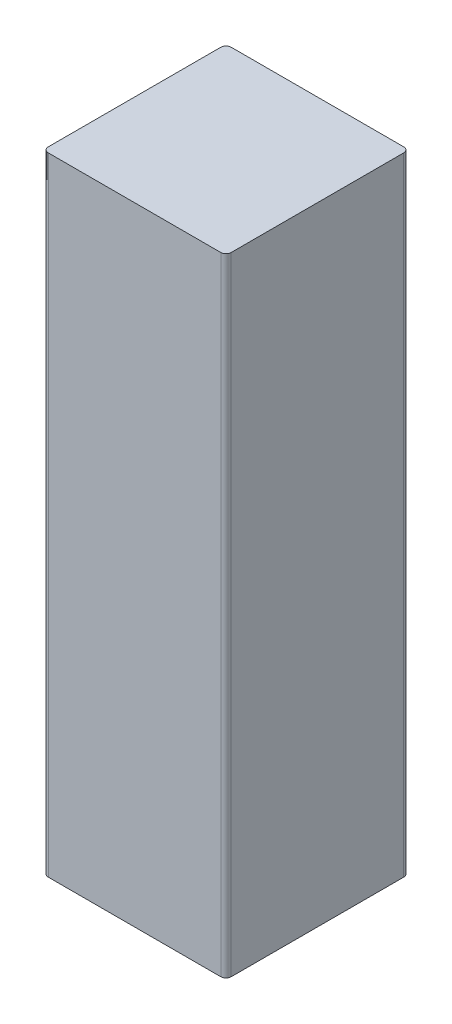
ISO-10303-21;
HEADER;
FILE_DESCRIPTION(('STEP AP214'),'2;1');
FILE_NAME('part.step','',(''),(''),'','','');
FILE_SCHEMA(('AUTOMOTIVE_DESIGN { 1 0 10303 214 1 1 1 1 }'));
ENDSEC;
DATA;
#1=APPLICATION_CONTEXT('core data for automotive mechanical design processes');
#2=APPLICATION_PROTOCOL_DEFINITION('international standard','automotive_design',2000,#1);
#3=PRODUCT_CONTEXT('',#1,'mechanical');
#4=PRODUCT('Part','Part','',(#3));
#5=PRODUCT_RELATED_PRODUCT_CATEGORY('part','',(#4));
#6=PRODUCT_DEFINITION_FORMATION('','',#4);
#7=PRODUCT_DEFINITION_CONTEXT('part definition',#1,'design');
#8=PRODUCT_DEFINITION('design','',#6,#7);
#9=PRODUCT_DEFINITION_SHAPE('','',#8);
#10=(LENGTH_UNIT() NAMED_UNIT(*) SI_UNIT(.MILLI.,.METRE.));
#11=(NAMED_UNIT(*) PLANE_ANGLE_UNIT() SI_UNIT($,.RADIAN.));
#12=(NAMED_UNIT(*) SI_UNIT($,.STERADIAN.) SOLID_ANGLE_UNIT());
#13=UNCERTAINTY_MEASURE_WITH_UNIT(LENGTH_MEASURE(1.E-05),#10,'distance_accuracy_value','');
#14=(GEOMETRIC_REPRESENTATION_CONTEXT(3) GLOBAL_UNCERTAINTY_ASSIGNED_CONTEXT((#13)) GLOBAL_UNIT_ASSIGNED_CONTEXT((#10,
#11,#12)) REPRESENTATION_CONTEXT('',''));
#15=CARTESIAN_POINT('',(0.,0.,0.));
#16=DIRECTION('',(0.,0.,1.));
#17=DIRECTION('',(1.,0.,0.));
#18=AXIS2_PLACEMENT_3D('',#15,#16,#17);
#19=CARTESIAN_POINT('',(44.45,304.8,-44.45));
#20=DIRECTION('',(-1.,0.,0.));
#21=DIRECTION('',(0.,0.,1.));
#22=AXIS2_PLACEMENT_3D('',#19,#20,#21);
#23=PLANE('',#22);
#24=DIRECTION('',(0.,0.,-1.));
#25=VECTOR('',#24,1.);
#26=CARTESIAN_POINT('',(44.45,0.,-44.45));
#27=LINE('',#26,#25);
#28=CARTESIAN_POINT('',(44.45,0.,41.9099999999999));
#29=VERTEX_POINT('',#28);
#30=CARTESIAN_POINT('',(44.45,0.,-41.91));
#31=VERTEX_POINT('',#30);
#32=EDGE_CURVE('E143',#29,#31,#27,.T.);
#33=ORIENTED_EDGE('',*,*,#32,.T.);
#34=DIRECTION('',(0.,-1.,0.));
#35=VECTOR('',#34,1.);
#36=CARTESIAN_POINT('',(44.45,304.8,-41.91));
#37=LINE('',#36,#35);
#38=CARTESIAN_POINT('',(44.45,304.8,-41.91));
#39=VERTEX_POINT('',#38);
#40=EDGE_CURVE('E11',#31,#39,#37,.F.);
#41=ORIENTED_EDGE('',*,*,#40,.T.);
#42=DIRECTION('',(0.,0.,-1.));
#43=VECTOR('',#42,1.);
#44=CARTESIAN_POINT('',(44.45,304.8,-44.45));
#45=LINE('',#44,#43);
#46=CARTESIAN_POINT('',(44.45,304.8,41.9099999999999));
#47=VERTEX_POINT('',#46);
#48=EDGE_CURVE('E141',#47,#39,#45,.T.);
#49=ORIENTED_EDGE('',*,*,#48,.F.);
#50=DIRECTION('',(0.,-1.,0.));
#51=VECTOR('',#50,1.);
#52=CARTESIAN_POINT('',(44.45,304.8,41.9099999999999));
#53=LINE('',#52,#51);
#54=EDGE_CURVE('E50',#47,#29,#53,.T.);
#55=ORIENTED_EDGE('',*,*,#54,.T.);
#56=EDGE_LOOP('',(#33,#41,#49,#55));
#57=FACE_BOUND('',#56,.T.);
#58=ADVANCED_FACE('F41',(#57),#23,.F.);
#59=CARTESIAN_POINT('',(-44.45,304.8,-44.45));
#60=DIRECTION('',(0.,0.,1.));
#61=DIRECTION('',(1.,0.,0.));
#62=AXIS2_PLACEMENT_3D('',#59,#60,#61);
#63=PLANE('',#62);
#64=DIRECTION('',(-1.,0.,0.));
#65=VECTOR('',#64,1.);
#66=CARTESIAN_POINT('',(-44.45,0.,-44.45));
#67=LINE('',#66,#65);
#68=CARTESIAN_POINT('',(41.91,0.,-44.45));
#69=VERTEX_POINT('',#68);
#70=CARTESIAN_POINT('',(-41.91,0.,-44.45));
#71=VERTEX_POINT('',#70);
#72=EDGE_CURVE('E137',#69,#71,#67,.T.);
#73=ORIENTED_EDGE('',*,*,#72,.T.);
#74=DIRECTION('',(0.,-1.,0.));
#75=VECTOR('',#74,1.);
#76=CARTESIAN_POINT('',(-41.91,304.8,-44.45));
#77=LINE('',#76,#75);
#78=CARTESIAN_POINT('',(-41.91,304.8,-44.45));
#79=VERTEX_POINT('',#78);
#80=EDGE_CURVE('E113',#71,#79,#77,.F.);
#81=ORIENTED_EDGE('',*,*,#80,.T.);
#82=DIRECTION('',(-1.,0.,0.));
#83=VECTOR('',#82,1.);
#84=CARTESIAN_POINT('',(-44.45,304.8,-44.45));
#85=LINE('',#84,#83);
#86=CARTESIAN_POINT('',(41.91,304.8,-44.45));
#87=VERTEX_POINT('',#86);
#88=EDGE_CURVE('E195',#87,#79,#85,.T.);
#89=ORIENTED_EDGE('',*,*,#88,.F.);
#90=DIRECTION('',(0.,-1.,0.));
#91=VECTOR('',#90,1.);
#92=CARTESIAN_POINT('',(41.91,304.8,-44.45));
#93=LINE('',#92,#91);
#94=EDGE_CURVE('E119',#87,#69,#93,.T.);
#95=ORIENTED_EDGE('',*,*,#94,.T.);
#96=EDGE_LOOP('',(#73,#81,#89,#95));
#97=FACE_BOUND('',#96,.T.);
#98=ADVANCED_FACE('F207',(#97),#63,.F.);
#99=CARTESIAN_POINT('',(-44.45,304.8,-44.45));
#100=DIRECTION('',(1.,0.,0.));
#101=DIRECTION('',(0.,0.,-1.));
#102=AXIS2_PLACEMENT_3D('',#99,#100,#101);
#103=PLANE('',#102);
#104=DIRECTION('',(0.,0.,1.));
#105=VECTOR('',#104,1.);
#106=CARTESIAN_POINT('',(-44.45,304.8,-44.45));
#107=LINE('',#106,#105);
#108=CARTESIAN_POINT('',(-44.45,304.8,-41.91));
#109=VERTEX_POINT('',#108);
#110=CARTESIAN_POINT('',(-44.45,304.8,41.91));
#111=VERTEX_POINT('',#110);
#112=EDGE_CURVE('E128',#109,#111,#107,.T.);
#113=ORIENTED_EDGE('',*,*,#112,.F.);
#114=DIRECTION('',(0.,-1.,0.));
#115=VECTOR('',#114,1.);
#116=CARTESIAN_POINT('',(-44.45,304.8,-41.91));
#117=LINE('',#116,#115);
#118=CARTESIAN_POINT('',(-44.45,0.,-41.91));
#119=VERTEX_POINT('',#118);
#120=EDGE_CURVE('E112',#109,#119,#117,.T.);
#121=ORIENTED_EDGE('',*,*,#120,.T.);
#122=DIRECTION('',(0.,0.,1.));
#123=VECTOR('',#122,1.);
#124=CARTESIAN_POINT('',(-44.45,0.,-44.45));
#125=LINE('',#124,#123);
#126=CARTESIAN_POINT('',(-44.45,0.,41.91));
#127=VERTEX_POINT('',#126);
#128=EDGE_CURVE('E126',#119,#127,#125,.T.);
#129=ORIENTED_EDGE('',*,*,#128,.T.);
#130=DIRECTION('',(0.,-1.,0.));
#131=VECTOR('',#130,1.);
#132=CARTESIAN_POINT('',(-44.45,304.8,41.91));
#133=LINE('',#132,#131);
#134=EDGE_CURVE('E131',#127,#111,#133,.F.);
#135=ORIENTED_EDGE('',*,*,#134,.T.);
#136=EDGE_LOOP('',(#113,#121,#129,#135));
#137=FACE_BOUND('',#136,.T.);
#138=ADVANCED_FACE('F125',(#137),#103,.F.);
#139=CARTESIAN_POINT('',(-44.45,304.8,44.45));
#140=DIRECTION('',(0.,0.,-1.));
#141=DIRECTION('',(-1.,0.,0.));
#142=AXIS2_PLACEMENT_3D('',#139,#140,#141);
#143=PLANE('',#142);
#144=DIRECTION('',(1.,0.,0.));
#145=VECTOR('',#144,1.);
#146=CARTESIAN_POINT('',(-44.45,304.8,44.45));
#147=LINE('',#146,#145);
#148=CARTESIAN_POINT('',(-41.91,304.8,44.45));
#149=VERTEX_POINT('',#148);
#150=CARTESIAN_POINT('',(41.91,304.8,44.45));
#151=VERTEX_POINT('',#150);
#152=EDGE_CURVE('E148',#149,#151,#147,.T.);
#153=ORIENTED_EDGE('',*,*,#152,.F.);
#154=DIRECTION('',(0.,-1.,0.));
#155=VECTOR('',#154,1.);
#156=CARTESIAN_POINT('',(-41.91,304.8,44.45));
#157=LINE('',#156,#155);
#158=CARTESIAN_POINT('',(-41.91,0.,44.45));
#159=VERTEX_POINT('',#158);
#160=EDGE_CURVE('E175',#149,#159,#157,.T.);
#161=ORIENTED_EDGE('',*,*,#160,.T.);
#162=DIRECTION('',(1.,0.,0.));
#163=VECTOR('',#162,1.);
#164=CARTESIAN_POINT('',(-44.45,0.,44.45));
#165=LINE('',#164,#163);
#166=CARTESIAN_POINT('',(41.91,0.,44.45));
#167=VERTEX_POINT('',#166);
#168=EDGE_CURVE('E136',#159,#167,#165,.T.);
#169=ORIENTED_EDGE('',*,*,#168,.T.);
#170=DIRECTION('',(0.,-1.,0.));
#171=VECTOR('',#170,1.);
#172=CARTESIAN_POINT('',(41.91,304.8,44.45));
#173=LINE('',#172,#171);
#174=EDGE_CURVE('E57',#167,#151,#173,.F.);
#175=ORIENTED_EDGE('',*,*,#174,.T.);
#176=EDGE_LOOP('',(#153,#161,#169,#175));
#177=FACE_BOUND('',#176,.T.);
#178=ADVANCED_FACE('F211',(#177),#143,.F.);
#179=CARTESIAN_POINT('',(0.,304.8,0.));
#180=DIRECTION('',(0.,1.,0.));
#181=DIRECTION('',(0.,0.,1.));
#182=AXIS2_PLACEMENT_3D('',#179,#180,#181);
#183=PLANE('',#182);
#184=ORIENTED_EDGE('',*,*,#88,.T.);
#185=CARTESIAN_POINT('',(-41.91,304.8,-41.91));
#186=DIRECTION('',(0.,1.,0.));
#187=DIRECTION('',(0.,0.,1.));
#188=AXIS2_PLACEMENT_3D('',#185,#186,#187);
#189=CIRCLE('',#188,2.54);
#190=EDGE_CURVE('E170',#79,#109,#189,.T.);
#191=ORIENTED_EDGE('',*,*,#190,.T.);
#192=ORIENTED_EDGE('',*,*,#112,.T.);
#193=CARTESIAN_POINT('',(-41.91,304.8,41.91));
#194=DIRECTION('',(0.,1.,0.));
#195=DIRECTION('',(0.,0.,1.));
#196=AXIS2_PLACEMENT_3D('',#193,#194,#195);
#197=CIRCLE('',#196,2.54);
#198=EDGE_CURVE('E64',#111,#149,#197,.T.);
#199=ORIENTED_EDGE('',*,*,#198,.T.);
#200=ORIENTED_EDGE('',*,*,#152,.T.);
#201=CARTESIAN_POINT('',(41.91,304.8,41.9099999999999));
#202=DIRECTION('',(0.,1.,0.));
#203=DIRECTION('',(0.,0.,1.));
#204=AXIS2_PLACEMENT_3D('',#201,#202,#203);
#205=CIRCLE('',#204,2.54);
#206=EDGE_CURVE('E162',#151,#47,#205,.T.);
#207=ORIENTED_EDGE('',*,*,#206,.T.);
#208=ORIENTED_EDGE('',*,*,#48,.T.);
#209=CARTESIAN_POINT('',(41.91,304.8,-41.91));
#210=DIRECTION('',(0.,1.,0.));
#211=DIRECTION('',(0.,0.,1.));
#212=AXIS2_PLACEMENT_3D('',#209,#210,#211);
#213=CIRCLE('',#212,2.54);
#214=EDGE_CURVE('E165',#39,#87,#213,.T.);
#215=ORIENTED_EDGE('',*,*,#214,.T.);
#216=EDGE_LOOP('',(#184,#191,#192,#199,#200,#207,#208,#215));
#217=FACE_BOUND('',#216,.T.);
#218=ADVANCED_FACE('F201',(#217),#183,.T.);
#219=CARTESIAN_POINT('',(0.,0.,0.));
#220=DIRECTION('',(0.,1.,0.));
#221=DIRECTION('',(0.,0.,1.));
#222=AXIS2_PLACEMENT_3D('',#219,#220,#221);
#223=PLANE('',#222);
#224=ORIENTED_EDGE('',*,*,#128,.F.);
#225=CARTESIAN_POINT('',(-41.91,0.,-41.91));
#226=DIRECTION('',(0.,1.,0.));
#227=DIRECTION('',(0.,0.,1.));
#228=AXIS2_PLACEMENT_3D('',#225,#226,#227);
#229=CIRCLE('',#228,2.54);
#230=EDGE_CURVE('E108',#119,#71,#229,.F.);
#231=ORIENTED_EDGE('',*,*,#230,.T.);
#232=ORIENTED_EDGE('',*,*,#72,.F.);
#233=CARTESIAN_POINT('',(41.91,0.,-41.91));
#234=DIRECTION('',(0.,1.,0.));
#235=DIRECTION('',(0.,0.,1.));
#236=AXIS2_PLACEMENT_3D('',#233,#234,#235);
#237=CIRCLE('',#236,2.54);
#238=EDGE_CURVE('E152',#69,#31,#237,.F.);
#239=ORIENTED_EDGE('',*,*,#238,.T.);
#240=ORIENTED_EDGE('',*,*,#32,.F.);
#241=CARTESIAN_POINT('',(41.91,0.,41.9099999999999));
#242=DIRECTION('',(0.,1.,0.));
#243=DIRECTION('',(0.,0.,1.));
#244=AXIS2_PLACEMENT_3D('',#241,#242,#243);
#245=CIRCLE('',#244,2.54);
#246=EDGE_CURVE('E130',#29,#167,#245,.F.);
#247=ORIENTED_EDGE('',*,*,#246,.T.);
#248=ORIENTED_EDGE('',*,*,#168,.F.);
#249=CARTESIAN_POINT('',(-41.91,0.,41.91));
#250=DIRECTION('',(0.,1.,0.));
#251=DIRECTION('',(0.,0.,1.));
#252=AXIS2_PLACEMENT_3D('',#249,#250,#251);
#253=CIRCLE('',#252,2.54);
#254=EDGE_CURVE('E120',#159,#127,#253,.F.);
#255=ORIENTED_EDGE('',*,*,#254,.T.);
#256=EDGE_LOOP('',(#224,#231,#232,#239,#240,#247,#248,#255));
#257=FACE_BOUND('',#256,.T.);
#258=ADVANCED_FACE('F133',(#257),#223,.F.);
#259=CARTESIAN_POINT('',(-41.91,304.8,-41.91));
#260=DIRECTION('',(0.,-1.,0.));
#261=DIRECTION('',(0.,0.,-1.));
#262=AXIS2_PLACEMENT_3D('',#259,#260,#261);
#263=CYLINDRICAL_SURFACE('',#262,2.54);
#264=ORIENTED_EDGE('',*,*,#190,.F.);
#265=ORIENTED_EDGE('',*,*,#80,.F.);
#266=ORIENTED_EDGE('',*,*,#230,.F.);
#267=ORIENTED_EDGE('',*,*,#120,.F.);
#268=EDGE_LOOP('',(#264,#265,#266,#267));
#269=FACE_BOUND('',#268,.T.);
#270=ADVANCED_FACE('F111',(#269),#263,.T.);
#271=CARTESIAN_POINT('',(-41.91,304.8,41.91));
#272=DIRECTION('',(0.,-1.,0.));
#273=DIRECTION('',(0.,0.,-1.));
#274=AXIS2_PLACEMENT_3D('',#271,#272,#273);
#275=CYLINDRICAL_SURFACE('',#274,2.54);
#276=ORIENTED_EDGE('',*,*,#198,.F.);
#277=ORIENTED_EDGE('',*,*,#134,.F.);
#278=ORIENTED_EDGE('',*,*,#254,.F.);
#279=ORIENTED_EDGE('',*,*,#160,.F.);
#280=EDGE_LOOP('',(#276,#277,#278,#279));
#281=FACE_BOUND('',#280,.T.);
#282=ADVANCED_FACE('F210',(#281),#275,.T.);
#283=CARTESIAN_POINT('',(41.91,304.8,-41.91));
#284=DIRECTION('',(0.,-1.,0.));
#285=DIRECTION('',(0.,0.,-1.));
#286=AXIS2_PLACEMENT_3D('',#283,#284,#285);
#287=CYLINDRICAL_SURFACE('',#286,2.54);
#288=ORIENTED_EDGE('',*,*,#214,.F.);
#289=ORIENTED_EDGE('',*,*,#40,.F.);
#290=ORIENTED_EDGE('',*,*,#238,.F.);
#291=ORIENTED_EDGE('',*,*,#94,.F.);
#292=EDGE_LOOP('',(#288,#289,#290,#291));
#293=FACE_BOUND('',#292,.T.);
#294=ADVANCED_FACE('F205',(#293),#287,.T.);
#295=CARTESIAN_POINT('',(41.91,304.8,41.9099999999999));
#296=DIRECTION('',(0.,-1.,0.));
#297=DIRECTION('',(0.,0.,-1.));
#298=AXIS2_PLACEMENT_3D('',#295,#296,#297);
#299=CYLINDRICAL_SURFACE('',#298,2.54);
#300=ORIENTED_EDGE('',*,*,#206,.F.);
#301=ORIENTED_EDGE('',*,*,#174,.F.);
#302=ORIENTED_EDGE('',*,*,#246,.F.);
#303=ORIENTED_EDGE('',*,*,#54,.F.);
#304=EDGE_LOOP('',(#300,#301,#302,#303));
#305=FACE_BOUND('',#304,.T.);
#306=ADVANCED_FACE('F43',(#305),#299,.T.);
#307=CLOSED_SHELL('',(#58,#98,#138,#178,#218,#258,#270,#282,#294,#306));
#308=MANIFOLD_SOLID_BREP('B2',#307);
#309=ADVANCED_BREP_SHAPE_REPRESENTATION('',(#18,#308),#14);
#310=SHAPE_DEFINITION_REPRESENTATION(#9,#309);
ENDSEC;
END-ISO-10303-21;
